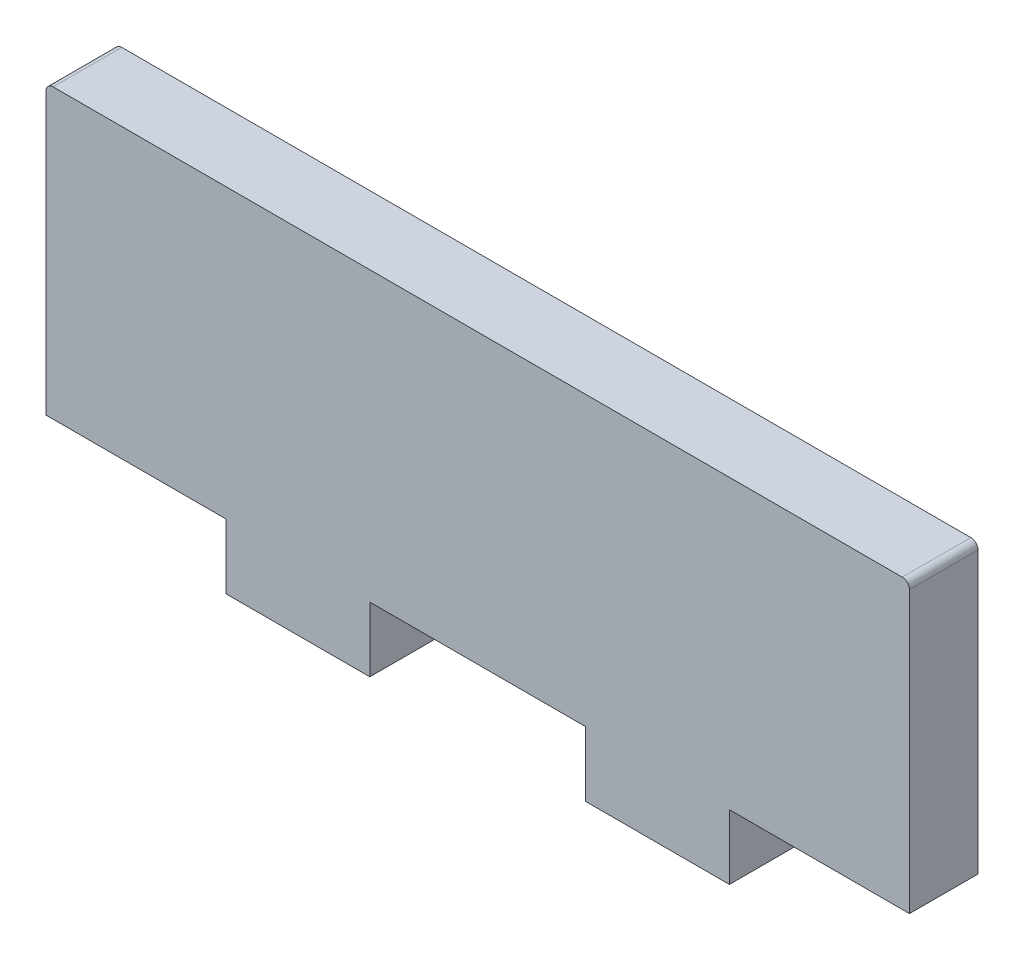
ISO-10303-21;
HEADER;
FILE_DESCRIPTION(('STEP AP214'),'2;1');
FILE_NAME('part.step','',(''),(''),'','','');
FILE_SCHEMA(('AUTOMOTIVE_DESIGN { 1 0 10303 214 1 1 1 1 }'));
ENDSEC;
DATA;
#1=APPLICATION_CONTEXT('core data for automotive mechanical design processes');
#2=APPLICATION_PROTOCOL_DEFINITION('international standard','automotive_design',2000,#1);
#3=PRODUCT_CONTEXT('',#1,'mechanical');
#4=PRODUCT('Part','Part','',(#3));
#5=PRODUCT_RELATED_PRODUCT_CATEGORY('part','',(#4));
#6=PRODUCT_DEFINITION_FORMATION('','',#4);
#7=PRODUCT_DEFINITION_CONTEXT('part definition',#1,'design');
#8=PRODUCT_DEFINITION('design','',#6,#7);
#9=PRODUCT_DEFINITION_SHAPE('','',#8);
#10=(LENGTH_UNIT() NAMED_UNIT(*) SI_UNIT(.MILLI.,.METRE.));
#11=(NAMED_UNIT(*) PLANE_ANGLE_UNIT() SI_UNIT($,.RADIAN.));
#12=(NAMED_UNIT(*) SI_UNIT($,.STERADIAN.) SOLID_ANGLE_UNIT());
#13=UNCERTAINTY_MEASURE_WITH_UNIT(LENGTH_MEASURE(1.E-05),#10,'distance_accuracy_value','');
#14=(GEOMETRIC_REPRESENTATION_CONTEXT(3) GLOBAL_UNCERTAINTY_ASSIGNED_CONTEXT((#13)) GLOBAL_UNIT_ASSIGNED_CONTEXT((#10,
#11,#12)) REPRESENTATION_CONTEXT('',''));
#15=CARTESIAN_POINT('',(0.,0.,0.));
#16=DIRECTION('',(0.,0.,1.));
#17=DIRECTION('',(1.,0.,0.));
#18=AXIS2_PLACEMENT_3D('',#15,#16,#17);
#19=CARTESIAN_POINT('',(60.,0.,4.7625));
#20=DIRECTION('',(1.,0.,0.));
#21=DIRECTION('',(0.,1.,0.));
#22=AXIS2_PLACEMENT_3D('',#19,#20,#21);
#23=PLANE('',#22);
#24=DIRECTION('',(0.,-1.,0.));
#25=VECTOR('',#24,1.);
#26=CARTESIAN_POINT('',(60.,0.,-4.7625));
#27=LINE('',#26,#25);
#28=CARTESIAN_POINT('',(60.,19.,-4.7625));
#29=VERTEX_POINT('',#28);
#30=CARTESIAN_POINT('',(60.,-20.,-4.7625));
#31=VERTEX_POINT('',#30);
#32=EDGE_CURVE('E182',#29,#31,#27,.T.);
#33=ORIENTED_EDGE('',*,*,#32,.F.);
#34=DIRECTION('',(0.,0.,-1.));
#35=VECTOR('',#34,1.);
#36=CARTESIAN_POINT('',(60.,19.,4.7625));
#37=LINE('',#36,#35);
#38=CARTESIAN_POINT('',(60.,19.,4.7625));
#39=VERTEX_POINT('',#38);
#40=EDGE_CURVE('E58',#29,#39,#37,.F.);
#41=ORIENTED_EDGE('',*,*,#40,.T.);
#42=DIRECTION('',(0.,-1.,0.));
#43=VECTOR('',#42,1.);
#44=CARTESIAN_POINT('',(60.,0.,4.7625));
#45=LINE('',#44,#43);
#46=CARTESIAN_POINT('',(60.,-20.,4.7625));
#47=VERTEX_POINT('',#46);
#48=EDGE_CURVE('E239',#39,#47,#45,.T.);
#49=ORIENTED_EDGE('',*,*,#48,.T.);
#50=DIRECTION('',(0.,0.,-1.));
#51=VECTOR('',#50,1.);
#52=CARTESIAN_POINT('',(60.,-20.,4.7625));
#53=LINE('',#52,#51);
#54=EDGE_CURVE('E165',#47,#31,#53,.T.);
#55=ORIENTED_EDGE('',*,*,#54,.T.);
#56=EDGE_LOOP('',(#33,#41,#49,#55));
#57=FACE_BOUND('',#56,.T.);
#58=ADVANCED_FACE('F35',(#57),#23,.T.);
#59=CARTESIAN_POINT('',(0.,20.,4.7625));
#60=DIRECTION('',(0.,1.,0.));
#61=DIRECTION('',(0.,0.,1.));
#62=AXIS2_PLACEMENT_3D('',#59,#60,#61);
#63=PLANE('',#62);
#64=DIRECTION('',(1.,0.,0.));
#65=VECTOR('',#64,1.);
#66=CARTESIAN_POINT('',(0.,20.,4.7625));
#67=LINE('',#66,#65);
#68=CARTESIAN_POINT('',(-59.,20.,4.7625));
#69=VERTEX_POINT('',#68);
#70=CARTESIAN_POINT('',(59.,20.,4.7625));
#71=VERTEX_POINT('',#70);
#72=EDGE_CURVE('E143',#69,#71,#67,.T.);
#73=ORIENTED_EDGE('',*,*,#72,.T.);
#74=DIRECTION('',(0.,0.,-1.));
#75=VECTOR('',#74,1.);
#76=CARTESIAN_POINT('',(59.,20.,4.7625));
#77=LINE('',#76,#75);
#78=CARTESIAN_POINT('',(59.,20.,-4.7625));
#79=VERTEX_POINT('',#78);
#80=EDGE_CURVE('E229',#71,#79,#77,.T.);
#81=ORIENTED_EDGE('',*,*,#80,.T.);
#82=DIRECTION('',(1.,0.,0.));
#83=VECTOR('',#82,1.);
#84=CARTESIAN_POINT('',(0.,20.,-4.7625));
#85=LINE('',#84,#83);
#86=CARTESIAN_POINT('',(-59.,20.,-4.7625));
#87=VERTEX_POINT('',#86);
#88=EDGE_CURVE('E184',#87,#79,#85,.T.);
#89=ORIENTED_EDGE('',*,*,#88,.F.);
#90=DIRECTION('',(0.,0.,-1.));
#91=VECTOR('',#90,1.);
#92=CARTESIAN_POINT('',(-59.,20.,4.7625));
#93=LINE('',#92,#91);
#94=EDGE_CURVE('E152',#87,#69,#93,.F.);
#95=ORIENTED_EDGE('',*,*,#94,.T.);
#96=EDGE_LOOP('',(#73,#81,#89,#95));
#97=FACE_BOUND('',#96,.T.);
#98=ADVANCED_FACE('F243',(#97),#63,.T.);
#99=CARTESIAN_POINT('',(-60.,0.,4.7625));
#100=DIRECTION('',(1.,0.,0.));
#101=DIRECTION('',(0.,1.,0.));
#102=AXIS2_PLACEMENT_3D('',#99,#100,#101);
#103=PLANE('',#102);
#104=DIRECTION('',(0.,-1.,0.));
#105=VECTOR('',#104,1.);
#106=CARTESIAN_POINT('',(-60.,0.,4.7625));
#107=LINE('',#106,#105);
#108=CARTESIAN_POINT('',(-60.,19.,4.7625));
#109=VERTEX_POINT('',#108);
#110=CARTESIAN_POINT('',(-60.,-20.,4.7625));
#111=VERTEX_POINT('',#110);
#112=EDGE_CURVE('E135',#109,#111,#107,.T.);
#113=ORIENTED_EDGE('',*,*,#112,.F.);
#114=DIRECTION('',(0.,0.,-1.));
#115=VECTOR('',#114,1.);
#116=CARTESIAN_POINT('',(-60.,19.,-4.7625));
#117=LINE('',#116,#115);
#118=CARTESIAN_POINT('',(-60.,19.,-4.7625));
#119=VERTEX_POINT('',#118);
#120=EDGE_CURVE('E11',#109,#119,#117,.T.);
#121=ORIENTED_EDGE('',*,*,#120,.T.);
#122=DIRECTION('',(0.,-1.,0.));
#123=VECTOR('',#122,1.);
#124=CARTESIAN_POINT('',(-60.,0.,-4.7625));
#125=LINE('',#124,#123);
#126=CARTESIAN_POINT('',(-60.,-20.,-4.7625));
#127=VERTEX_POINT('',#126);
#128=EDGE_CURVE('E149',#119,#127,#125,.T.);
#129=ORIENTED_EDGE('',*,*,#128,.T.);
#130=DIRECTION('',(0.,0.,-1.));
#131=VECTOR('',#130,1.);
#132=CARTESIAN_POINT('',(-60.,-20.,4.7625));
#133=LINE('',#132,#131);
#134=EDGE_CURVE('E146',#111,#127,#133,.T.);
#135=ORIENTED_EDGE('',*,*,#134,.F.);
#136=EDGE_LOOP('',(#113,#121,#129,#135));
#137=FACE_BOUND('',#136,.T.);
#138=ADVANCED_FACE('F147',(#137),#103,.F.);
#139=CARTESIAN_POINT('',(0.,-20.,4.7625));
#140=DIRECTION('',(0.,1.,0.));
#141=DIRECTION('',(0.,0.,1.));
#142=AXIS2_PLACEMENT_3D('',#139,#140,#141);
#143=PLANE('',#142);
#144=DIRECTION('',(1.,0.,0.));
#145=VECTOR('',#144,1.);
#146=CARTESIAN_POINT('',(0.,-20.,-4.7625));
#147=LINE('',#146,#145);
#148=CARTESIAN_POINT('',(-34.98,-20.,-4.7625));
#149=VERTEX_POINT('',#148);
#150=EDGE_CURVE('E188',#127,#149,#147,.T.);
#151=ORIENTED_EDGE('',*,*,#150,.T.);
#152=DIRECTION('',(0.,0.,-1.));
#153=VECTOR('',#152,1.);
#154=CARTESIAN_POINT('',(-34.98,-20.,4.7625));
#155=LINE('',#154,#153);
#156=CARTESIAN_POINT('',(-34.98,-20.,4.7625));
#157=VERTEX_POINT('',#156);
#158=EDGE_CURVE('E153',#157,#149,#155,.T.);
#159=ORIENTED_EDGE('',*,*,#158,.F.);
#160=DIRECTION('',(1.,0.,0.));
#161=VECTOR('',#160,1.);
#162=CARTESIAN_POINT('',(0.,-20.,4.7625));
#163=LINE('',#162,#161);
#164=EDGE_CURVE('E139',#111,#157,#163,.T.);
#165=ORIENTED_EDGE('',*,*,#164,.F.);
#166=ORIENTED_EDGE('',*,*,#134,.T.);
#167=EDGE_LOOP('',(#151,#159,#165,#166));
#168=FACE_BOUND('',#167,.T.);
#169=ADVANCED_FACE('F155',(#168),#143,.F.);
#170=CARTESIAN_POINT('',(-34.98,0.,4.7625));
#171=DIRECTION('',(1.,0.,0.));
#172=DIRECTION('',(0.,1.,0.));
#173=AXIS2_PLACEMENT_3D('',#170,#171,#172);
#174=PLANE('',#173);
#175=DIRECTION('',(0.,-1.,0.));
#176=VECTOR('',#175,1.);
#177=CARTESIAN_POINT('',(-34.98,0.,-4.7625));
#178=LINE('',#177,#176);
#179=CARTESIAN_POINT('',(-34.98,-29.,-4.7625));
#180=VERTEX_POINT('',#179);
#181=EDGE_CURVE('E190',#149,#180,#178,.T.);
#182=ORIENTED_EDGE('',*,*,#181,.T.);
#183=DIRECTION('',(0.,0.,-1.));
#184=VECTOR('',#183,1.);
#185=CARTESIAN_POINT('',(-34.98,-29.,4.7625));
#186=LINE('',#185,#184);
#187=CARTESIAN_POINT('',(-34.98,-29.,4.7625));
#188=VERTEX_POINT('',#187);
#189=EDGE_CURVE('E224',#188,#180,#186,.T.);
#190=ORIENTED_EDGE('',*,*,#189,.F.);
#191=DIRECTION('',(0.,-1.,0.));
#192=VECTOR('',#191,1.);
#193=CARTESIAN_POINT('',(-34.98,0.,4.7625));
#194=LINE('',#193,#192);
#195=EDGE_CURVE('E158',#157,#188,#194,.T.);
#196=ORIENTED_EDGE('',*,*,#195,.F.);
#197=ORIENTED_EDGE('',*,*,#158,.T.);
#198=EDGE_LOOP('',(#182,#190,#196,#197));
#199=FACE_BOUND('',#198,.T.);
#200=ADVANCED_FACE('F328',(#199),#174,.F.);
#201=CARTESIAN_POINT('',(0.,-29.,4.7625));
#202=DIRECTION('',(0.,1.,0.));
#203=DIRECTION('',(0.,0.,1.));
#204=AXIS2_PLACEMENT_3D('',#201,#202,#203);
#205=PLANE('',#204);
#206=DIRECTION('',(1.,0.,0.));
#207=VECTOR('',#206,1.);
#208=CARTESIAN_POINT('',(0.,-29.,-4.7625));
#209=LINE('',#208,#207);
#210=CARTESIAN_POINT('',(-15.,-29.,-4.7625));
#211=VERTEX_POINT('',#210);
#212=EDGE_CURVE('E194',#180,#211,#209,.T.);
#213=ORIENTED_EDGE('',*,*,#212,.T.);
#214=DIRECTION('',(0.,0.,-1.));
#215=VECTOR('',#214,1.);
#216=CARTESIAN_POINT('',(-15.,-29.,4.7625));
#217=LINE('',#216,#215);
#218=CARTESIAN_POINT('',(-15.,-29.,4.7625));
#219=VERTEX_POINT('',#218);
#220=EDGE_CURVE('E222',#219,#211,#217,.T.);
#221=ORIENTED_EDGE('',*,*,#220,.F.);
#222=DIRECTION('',(1.,0.,0.));
#223=VECTOR('',#222,1.);
#224=CARTESIAN_POINT('',(0.,-29.,4.7625));
#225=LINE('',#224,#223);
#226=EDGE_CURVE('E162',#188,#219,#225,.T.);
#227=ORIENTED_EDGE('',*,*,#226,.F.);
#228=ORIENTED_EDGE('',*,*,#189,.T.);
#229=EDGE_LOOP('',(#213,#221,#227,#228));
#230=FACE_BOUND('',#229,.T.);
#231=ADVANCED_FACE('F342',(#230),#205,.F.);
#232=CARTESIAN_POINT('',(-15.,0.,4.7625));
#233=DIRECTION('',(1.,0.,0.));
#234=DIRECTION('',(0.,1.,0.));
#235=AXIS2_PLACEMENT_3D('',#232,#233,#234);
#236=PLANE('',#235);
#237=DIRECTION('',(0.,-1.,0.));
#238=VECTOR('',#237,1.);
#239=CARTESIAN_POINT('',(-15.,0.,-4.7625));
#240=LINE('',#239,#238);
#241=CARTESIAN_POINT('',(-15.,-20.,-4.7625));
#242=VERTEX_POINT('',#241);
#243=EDGE_CURVE('E197',#242,#211,#240,.T.);
#244=ORIENTED_EDGE('',*,*,#243,.F.);
#245=DIRECTION('',(0.,0.,-1.));
#246=VECTOR('',#245,1.);
#247=CARTESIAN_POINT('',(-15.,-20.,4.7625));
#248=LINE('',#247,#246);
#249=CARTESIAN_POINT('',(-15.,-20.,4.7625));
#250=VERTEX_POINT('',#249);
#251=EDGE_CURVE('E220',#250,#242,#248,.T.);
#252=ORIENTED_EDGE('',*,*,#251,.F.);
#253=DIRECTION('',(0.,-1.,0.));
#254=VECTOR('',#253,1.);
#255=CARTESIAN_POINT('',(-15.,0.,4.7625));
#256=LINE('',#255,#254);
#257=EDGE_CURVE('E168',#250,#219,#256,.T.);
#258=ORIENTED_EDGE('',*,*,#257,.T.);
#259=ORIENTED_EDGE('',*,*,#220,.T.);
#260=EDGE_LOOP('',(#244,#252,#258,#259));
#261=FACE_BOUND('',#260,.T.);
#262=ADVANCED_FACE('F351',(#261),#236,.T.);
#263=CARTESIAN_POINT('',(15.,-20.,-4.7625));
#264=VERTEX_POINT('',#263);
#265=EDGE_CURVE('E192',#242,#264,#147,.T.);
#266=ORIENTED_EDGE('',*,*,#265,.T.);
#267=DIRECTION('',(0.,0.,-1.));
#268=VECTOR('',#267,1.);
#269=CARTESIAN_POINT('',(15.,-20.,4.7625));
#270=LINE('',#269,#268);
#271=CARTESIAN_POINT('',(15.,-20.,4.7625));
#272=VERTEX_POINT('',#271);
#273=EDGE_CURVE('E217',#272,#264,#270,.T.);
#274=ORIENTED_EDGE('',*,*,#273,.F.);
#275=EDGE_CURVE('E161',#250,#272,#163,.T.);
#276=ORIENTED_EDGE('',*,*,#275,.F.);
#277=ORIENTED_EDGE('',*,*,#251,.T.);
#278=EDGE_LOOP('',(#266,#274,#276,#277));
#279=FACE_BOUND('',#278,.T.);
#280=ADVANCED_FACE('F260',(#279),#143,.F.);
#281=CARTESIAN_POINT('',(15.,0.,4.7625));
#282=DIRECTION('',(1.,0.,0.));
#283=DIRECTION('',(0.,1.,0.));
#284=AXIS2_PLACEMENT_3D('',#281,#282,#283);
#285=PLANE('',#284);
#286=DIRECTION('',(0.,-1.,0.));
#287=VECTOR('',#286,1.);
#288=CARTESIAN_POINT('',(15.,0.,-4.7625));
#289=LINE('',#288,#287);
#290=CARTESIAN_POINT('',(15.,-29.,-4.7625));
#291=VERTEX_POINT('',#290);
#292=EDGE_CURVE('E200',#264,#291,#289,.T.);
#293=ORIENTED_EDGE('',*,*,#292,.T.);
#294=DIRECTION('',(0.,0.,-1.));
#295=VECTOR('',#294,1.);
#296=CARTESIAN_POINT('',(15.,-29.,4.7625));
#297=LINE('',#296,#295);
#298=CARTESIAN_POINT('',(15.,-29.,4.7625));
#299=VERTEX_POINT('',#298);
#300=EDGE_CURVE('E214',#299,#291,#297,.T.);
#301=ORIENTED_EDGE('',*,*,#300,.F.);
#302=DIRECTION('',(0.,-1.,0.));
#303=VECTOR('',#302,1.);
#304=CARTESIAN_POINT('',(15.,0.,4.7625));
#305=LINE('',#304,#303);
#306=EDGE_CURVE('E167',#272,#299,#305,.T.);
#307=ORIENTED_EDGE('',*,*,#306,.F.);
#308=ORIENTED_EDGE('',*,*,#273,.T.);
#309=EDGE_LOOP('',(#293,#301,#307,#308));
#310=FACE_BOUND('',#309,.T.);
#311=ADVANCED_FACE('F265',(#310),#285,.F.);
#312=CARTESIAN_POINT('',(0.,-29.,4.7625));
#313=DIRECTION('',(0.,1.,0.));
#314=DIRECTION('',(0.,0.,1.));
#315=AXIS2_PLACEMENT_3D('',#312,#313,#314);
#316=PLANE('',#315);
#317=DIRECTION('',(1.,0.,0.));
#318=VECTOR('',#317,1.);
#319=CARTESIAN_POINT('',(0.,-29.,-4.7625));
#320=LINE('',#319,#318);
#321=CARTESIAN_POINT('',(34.98,-29.,-4.7625));
#322=VERTEX_POINT('',#321);
#323=EDGE_CURVE('E202',#291,#322,#320,.T.);
#324=ORIENTED_EDGE('',*,*,#323,.T.);
#325=DIRECTION('',(0.,0.,-1.));
#326=VECTOR('',#325,1.);
#327=CARTESIAN_POINT('',(34.98,-29.,4.7625));
#328=LINE('',#327,#326);
#329=CARTESIAN_POINT('',(34.98,-29.,4.7625));
#330=VERTEX_POINT('',#329);
#331=EDGE_CURVE('E212',#330,#322,#328,.T.);
#332=ORIENTED_EDGE('',*,*,#331,.F.);
#333=DIRECTION('',(1.,0.,0.));
#334=VECTOR('',#333,1.);
#335=CARTESIAN_POINT('',(0.,-29.,4.7625));
#336=LINE('',#335,#334);
#337=EDGE_CURVE('E172',#299,#330,#336,.T.);
#338=ORIENTED_EDGE('',*,*,#337,.F.);
#339=ORIENTED_EDGE('',*,*,#300,.T.);
#340=EDGE_LOOP('',(#324,#332,#338,#339));
#341=FACE_BOUND('',#340,.T.);
#342=ADVANCED_FACE('F270',(#341),#316,.F.);
#343=CARTESIAN_POINT('',(34.98,0.,4.7625));
#344=DIRECTION('',(1.,0.,0.));
#345=DIRECTION('',(0.,0.,-1.));
#346=AXIS2_PLACEMENT_3D('',#343,#344,#345);
#347=PLANE('',#346);
#348=DIRECTION('',(0.,-1.,0.));
#349=VECTOR('',#348,1.);
#350=CARTESIAN_POINT('',(34.98,0.,-4.7625));
#351=LINE('',#350,#349);
#352=CARTESIAN_POINT('',(34.98,-20.,-4.7625));
#353=VERTEX_POINT('',#352);
#354=EDGE_CURVE('E205',#353,#322,#351,.T.);
#355=ORIENTED_EDGE('',*,*,#354,.F.);
#356=DIRECTION('',(0.,0.,-1.));
#357=VECTOR('',#356,1.);
#358=CARTESIAN_POINT('',(34.98,-20.,4.7625));
#359=LINE('',#358,#357);
#360=CARTESIAN_POINT('',(34.98,-20.,4.7625));
#361=VERTEX_POINT('',#360);
#362=EDGE_CURVE('E210',#361,#353,#359,.T.);
#363=ORIENTED_EDGE('',*,*,#362,.F.);
#364=DIRECTION('',(0.,-1.,0.));
#365=VECTOR('',#364,1.);
#366=CARTESIAN_POINT('',(34.98,0.,4.7625));
#367=LINE('',#366,#365);
#368=EDGE_CURVE('E166',#361,#330,#367,.T.);
#369=ORIENTED_EDGE('',*,*,#368,.T.);
#370=ORIENTED_EDGE('',*,*,#331,.T.);
#371=EDGE_LOOP('',(#355,#363,#369,#370));
#372=FACE_BOUND('',#371,.T.);
#373=ADVANCED_FACE('F274',(#372),#347,.T.);
#374=EDGE_CURVE('E191',#353,#31,#147,.T.);
#375=ORIENTED_EDGE('',*,*,#374,.T.);
#376=ORIENTED_EDGE('',*,*,#54,.F.);
#377=EDGE_CURVE('E160',#361,#47,#163,.T.);
#378=ORIENTED_EDGE('',*,*,#377,.F.);
#379=ORIENTED_EDGE('',*,*,#362,.T.);
#380=EDGE_LOOP('',(#375,#376,#378,#379));
#381=FACE_BOUND('',#380,.T.);
#382=ADVANCED_FACE('F255',(#381),#143,.F.);
#383=CARTESIAN_POINT('',(0.,0.,4.7625));
#384=DIRECTION('',(0.,0.,1.));
#385=DIRECTION('',(1.,0.,0.));
#386=AXIS2_PLACEMENT_3D('',#383,#384,#385);
#387=PLANE('',#386);
#388=ORIENTED_EDGE('',*,*,#48,.F.);
#389=CARTESIAN_POINT('',(59.,19.,4.7625));
#390=DIRECTION('',(0.,0.,1.));
#391=DIRECTION('',(1.,0.,0.));
#392=AXIS2_PLACEMENT_3D('',#389,#390,#391);
#393=CIRCLE('',#392,1.);
#394=EDGE_CURVE('E43',#39,#71,#393,.T.);
#395=ORIENTED_EDGE('',*,*,#394,.T.);
#396=ORIENTED_EDGE('',*,*,#72,.F.);
#397=CARTESIAN_POINT('',(-59.,19.,4.7625));
#398=DIRECTION('',(0.,0.,1.));
#399=DIRECTION('',(1.,0.,0.));
#400=AXIS2_PLACEMENT_3D('',#397,#398,#399);
#401=CIRCLE('',#400,1.);
#402=EDGE_CURVE('E50',#69,#109,#401,.T.);
#403=ORIENTED_EDGE('',*,*,#402,.T.);
#404=ORIENTED_EDGE('',*,*,#112,.T.);
#405=ORIENTED_EDGE('',*,*,#164,.T.);
#406=ORIENTED_EDGE('',*,*,#195,.T.);
#407=ORIENTED_EDGE('',*,*,#226,.T.);
#408=ORIENTED_EDGE('',*,*,#257,.F.);
#409=ORIENTED_EDGE('',*,*,#275,.T.);
#410=ORIENTED_EDGE('',*,*,#306,.T.);
#411=ORIENTED_EDGE('',*,*,#337,.T.);
#412=ORIENTED_EDGE('',*,*,#368,.F.);
#413=ORIENTED_EDGE('',*,*,#377,.T.);
#414=EDGE_LOOP('',(#388,#395,#396,#403,#404,#405,#406,#407,#408,#409,#410,#411,#412,#413));
#415=FACE_BOUND('',#414,.T.);
#416=ADVANCED_FACE('F137',(#415),#387,.T.);
#417=CARTESIAN_POINT('',(0.,0.,-4.7625));
#418=DIRECTION('',(0.,0.,1.));
#419=DIRECTION('',(1.,0.,0.));
#420=AXIS2_PLACEMENT_3D('',#417,#418,#419);
#421=PLANE('',#420);
#422=ORIENTED_EDGE('',*,*,#88,.T.);
#423=CARTESIAN_POINT('',(59.,19.,-4.7625));
#424=DIRECTION('',(0.,0.,1.));
#425=DIRECTION('',(1.,0.,0.));
#426=AXIS2_PLACEMENT_3D('',#423,#424,#425);
#427=CIRCLE('',#426,1.);
#428=EDGE_CURVE('E234',#79,#29,#427,.F.);
#429=ORIENTED_EDGE('',*,*,#428,.T.);
#430=ORIENTED_EDGE('',*,*,#32,.T.);
#431=ORIENTED_EDGE('',*,*,#374,.F.);
#432=ORIENTED_EDGE('',*,*,#354,.T.);
#433=ORIENTED_EDGE('',*,*,#323,.F.);
#434=ORIENTED_EDGE('',*,*,#292,.F.);
#435=ORIENTED_EDGE('',*,*,#265,.F.);
#436=ORIENTED_EDGE('',*,*,#243,.T.);
#437=ORIENTED_EDGE('',*,*,#212,.F.);
#438=ORIENTED_EDGE('',*,*,#181,.F.);
#439=ORIENTED_EDGE('',*,*,#150,.F.);
#440=ORIENTED_EDGE('',*,*,#128,.F.);
#441=CARTESIAN_POINT('',(-59.,19.,-4.7625));
#442=DIRECTION('',(0.,0.,1.));
#443=DIRECTION('',(1.,0.,0.));
#444=AXIS2_PLACEMENT_3D('',#441,#442,#443);
#445=CIRCLE('',#444,1.);
#446=EDGE_CURVE('E232',#119,#87,#445,.F.);
#447=ORIENTED_EDGE('',*,*,#446,.T.);
#448=EDGE_LOOP('',(#422,#429,#430,#431,#432,#433,#434,#435,#436,#437,#438,#439,#440,#447));
#449=FACE_BOUND('',#448,.T.);
#450=ADVANCED_FACE('F249',(#449),#421,.F.);
#451=CARTESIAN_POINT('',(59.,19.,4.7625));
#452=DIRECTION('',(0.,0.,-1.));
#453=DIRECTION('',(-1.,0.,0.));
#454=AXIS2_PLACEMENT_3D('',#451,#452,#453);
#455=CYLINDRICAL_SURFACE('',#454,1.);
#456=ORIENTED_EDGE('',*,*,#394,.F.);
#457=ORIENTED_EDGE('',*,*,#40,.F.);
#458=ORIENTED_EDGE('',*,*,#428,.F.);
#459=ORIENTED_EDGE('',*,*,#80,.F.);
#460=EDGE_LOOP('',(#456,#457,#458,#459));
#461=FACE_BOUND('',#460,.T.);
#462=ADVANCED_FACE('F247',(#461),#455,.T.);
#463=CARTESIAN_POINT('',(-59.,19.,4.7625));
#464=DIRECTION('',(0.,0.,1.));
#465=DIRECTION('',(1.,0.,0.));
#466=AXIS2_PLACEMENT_3D('',#463,#464,#465);
#467=CYLINDRICAL_SURFACE('',#466,1.);
#468=ORIENTED_EDGE('',*,*,#402,.F.);
#469=ORIENTED_EDGE('',*,*,#94,.F.);
#470=ORIENTED_EDGE('',*,*,#446,.F.);
#471=ORIENTED_EDGE('',*,*,#120,.F.);
#472=EDGE_LOOP('',(#468,#469,#470,#471));
#473=FACE_BOUND('',#472,.T.);
#474=ADVANCED_FACE('F37',(#473),#467,.T.);
#475=CLOSED_SHELL('',(#58,#98,#138,#169,#200,#231,#262,#280,#311,#342,#373,#382,#416,#450,#462,#474));
#476=MANIFOLD_SOLID_BREP('B2',#475);
#477=ADVANCED_BREP_SHAPE_REPRESENTATION('',(#18,#476),#14);
#478=SHAPE_DEFINITION_REPRESENTATION(#9,#477);
ENDSEC;
END-ISO-10303-21;
